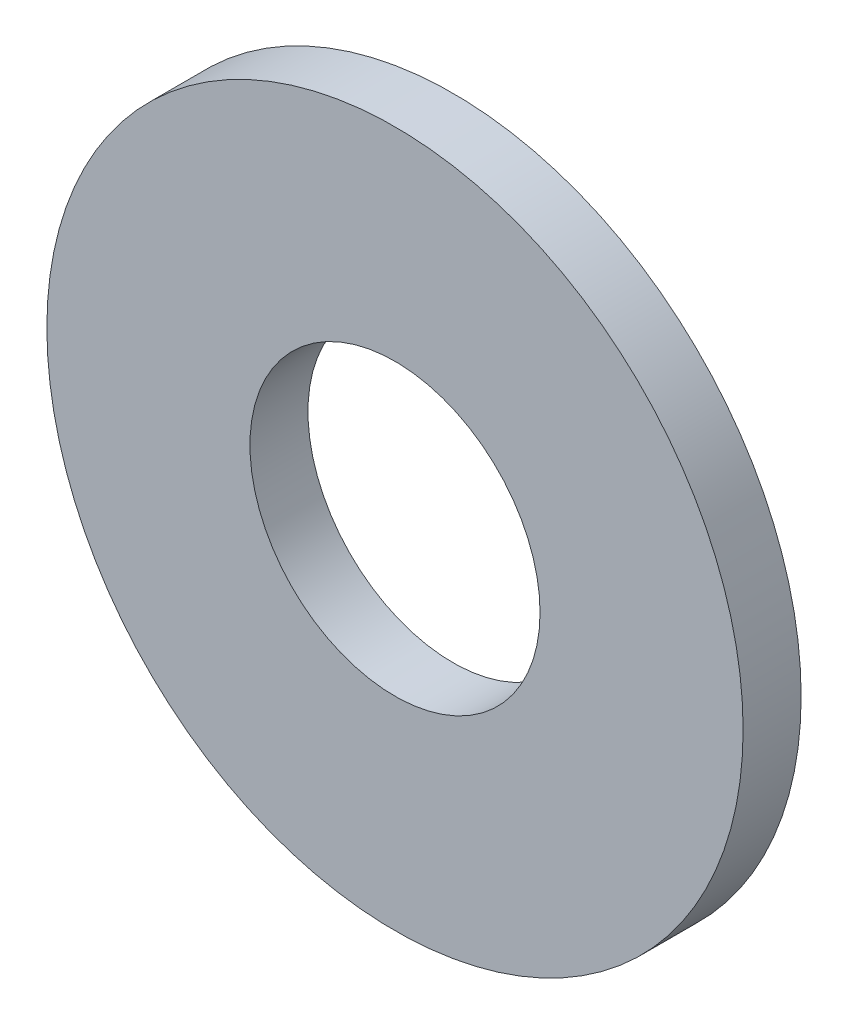
ISO-10303-21;
HEADER;
FILE_DESCRIPTION(('STEP AP214'),'2;1');
FILE_NAME('part.step','',(''),(''),'','','');
FILE_SCHEMA(('AUTOMOTIVE_DESIGN { 1 0 10303 214 1 1 1 1 }'));
ENDSEC;
DATA;
#1=APPLICATION_CONTEXT('core data for automotive mechanical design processes');
#2=APPLICATION_PROTOCOL_DEFINITION('international standard','automotive_design',2000,#1);
#3=PRODUCT_CONTEXT('',#1,'mechanical');
#4=PRODUCT('Part','Part','',(#3));
#5=PRODUCT_RELATED_PRODUCT_CATEGORY('part','',(#4));
#6=PRODUCT_DEFINITION_FORMATION('','',#4);
#7=PRODUCT_DEFINITION_CONTEXT('part definition',#1,'design');
#8=PRODUCT_DEFINITION('design','',#6,#7);
#9=PRODUCT_DEFINITION_SHAPE('','',#8);
#10=(LENGTH_UNIT() NAMED_UNIT(*) SI_UNIT(.MILLI.,.METRE.));
#11=(NAMED_UNIT(*) PLANE_ANGLE_UNIT() SI_UNIT($,.RADIAN.));
#12=(NAMED_UNIT(*) SI_UNIT($,.STERADIAN.) SOLID_ANGLE_UNIT());
#13=UNCERTAINTY_MEASURE_WITH_UNIT(LENGTH_MEASURE(1.E-05),#10,'distance_accuracy_value','');
#14=(GEOMETRIC_REPRESENTATION_CONTEXT(3) GLOBAL_UNCERTAINTY_ASSIGNED_CONTEXT((#13)) GLOBAL_UNIT_ASSIGNED_CONTEXT((#10,
#11,#12)) REPRESENTATION_CONTEXT('',''));
#15=CARTESIAN_POINT('',(0.,0.,0.));
#16=DIRECTION('',(0.,0.,1.));
#17=DIRECTION('',(1.,0.,0.));
#18=AXIS2_PLACEMENT_3D('',#15,#16,#17);
#19=CARTESIAN_POINT('',(0.,0.,2.));
#20=DIRECTION('',(0.,0.,1.));
#21=DIRECTION('',(1.,0.,0.));
#22=AXIS2_PLACEMENT_3D('',#19,#20,#21);
#23=PLANE('',#22);
#24=CARTESIAN_POINT('',(0.,0.,2.));
#25=DIRECTION('',(0.,0.,1.));
#26=DIRECTION('',(1.,0.,0.));
#27=AXIS2_PLACEMENT_3D('',#24,#25,#26);
#28=CIRCLE('',#27,12.);
#29=CARTESIAN_POINT('',(12.,0.,2.));
#30=VERTEX_POINT('',#29);
#31=EDGE_CURVE('E10',#30,#30,#28,.T.);
#32=ORIENTED_EDGE('',*,*,#31,.T.);
#33=EDGE_LOOP('',(#32));
#34=FACE_BOUND('',#33,.T.);
#35=CARTESIAN_POINT('',(0.,0.,2.));
#36=DIRECTION('',(0.,0.,1.));
#37=DIRECTION('',(1.,0.,0.));
#38=AXIS2_PLACEMENT_3D('',#35,#36,#37);
#39=CIRCLE('',#38,5.);
#40=CARTESIAN_POINT('',(5.,0.,2.));
#41=VERTEX_POINT('',#40);
#42=EDGE_CURVE('E43',#41,#41,#39,.T.);
#43=ORIENTED_EDGE('',*,*,#42,.F.);
#44=EDGE_LOOP('',(#43));
#45=FACE_BOUND('',#44,.T.);
#46=ADVANCED_FACE('F32',(#34,#45),#23,.T.);
#47=CARTESIAN_POINT('',(0.,0.,0.));
#48=DIRECTION('',(0.,0.,1.));
#49=DIRECTION('',(1.,0.,0.));
#50=AXIS2_PLACEMENT_3D('',#47,#48,#49);
#51=PLANE('',#50);
#52=CARTESIAN_POINT('',(0.,0.,0.));
#53=DIRECTION('',(0.,0.,1.));
#54=DIRECTION('',(1.,0.,0.));
#55=AXIS2_PLACEMENT_3D('',#52,#53,#54);
#56=CIRCLE('',#55,12.);
#57=CARTESIAN_POINT('',(12.,0.,0.));
#58=VERTEX_POINT('',#57);
#59=EDGE_CURVE('E36',#58,#58,#56,.T.);
#60=ORIENTED_EDGE('',*,*,#59,.F.);
#61=EDGE_LOOP('',(#60));
#62=FACE_BOUND('',#61,.T.);
#63=CARTESIAN_POINT('',(0.,0.,0.));
#64=DIRECTION('',(0.,0.,1.));
#65=DIRECTION('',(1.,0.,0.));
#66=AXIS2_PLACEMENT_3D('',#63,#64,#65);
#67=CIRCLE('',#66,5.);
#68=CARTESIAN_POINT('',(5.,0.,0.));
#69=VERTEX_POINT('',#68);
#70=EDGE_CURVE('E45',#69,#69,#67,.T.);
#71=ORIENTED_EDGE('',*,*,#70,.T.);
#72=EDGE_LOOP('',(#71));
#73=FACE_BOUND('',#72,.T.);
#74=ADVANCED_FACE('F55',(#62,#73),#51,.F.);
#75=CARTESIAN_POINT('',(0.,0.,2.));
#76=DIRECTION('',(0.,0.,-1.));
#77=DIRECTION('',(-1.,0.,0.));
#78=AXIS2_PLACEMENT_3D('',#75,#76,#77);
#79=CYLINDRICAL_SURFACE('',#78,12.);
#80=ORIENTED_EDGE('',*,*,#31,.F.);
#81=EDGE_LOOP('',(#80));
#82=FACE_BOUND('',#81,.T.);
#83=ORIENTED_EDGE('',*,*,#59,.T.);
#84=EDGE_LOOP('',(#83));
#85=FACE_BOUND('',#84,.T.);
#86=ADVANCED_FACE('F34',(#82,#85),#79,.T.);
#87=CARTESIAN_POINT('',(0.,0.,2.));
#88=DIRECTION('',(0.,0.,-1.));
#89=DIRECTION('',(-1.,0.,0.));
#90=AXIS2_PLACEMENT_3D('',#87,#88,#89);
#91=CYLINDRICAL_SURFACE('',#90,5.);
#92=ORIENTED_EDGE('',*,*,#42,.T.);
#93=EDGE_LOOP('',(#92));
#94=FACE_BOUND('',#93,.T.);
#95=ORIENTED_EDGE('',*,*,#70,.F.);
#96=EDGE_LOOP('',(#95));
#97=FACE_BOUND('',#96,.T.);
#98=ADVANCED_FACE('F51',(#94,#97),#91,.F.);
#99=CLOSED_SHELL('',(#46,#74,#86,#98));
#100=MANIFOLD_SOLID_BREP('B2',#99);
#101=ADVANCED_BREP_SHAPE_REPRESENTATION('',(#18,#100),#14);
#102=SHAPE_DEFINITION_REPRESENTATION(#9,#101);
ENDSEC;
END-ISO-10303-21;
